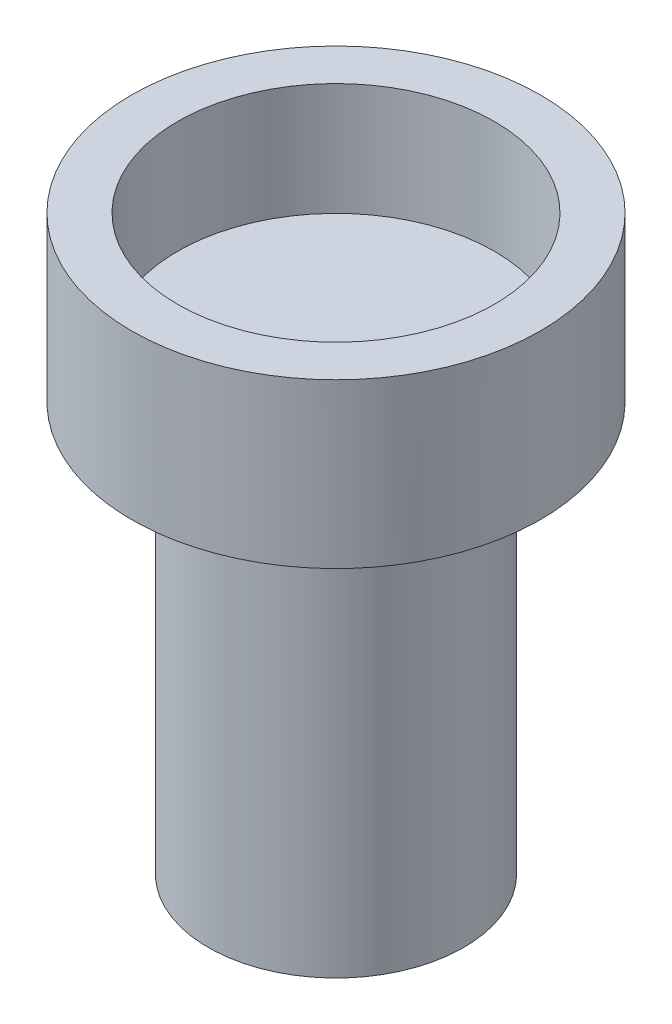
ISO-10303-21;
HEADER;
FILE_DESCRIPTION(('STEP AP214'),'2;1');
FILE_NAME('part.step','',(''),(''),'','','');
FILE_SCHEMA(('AUTOMOTIVE_DESIGN { 1 0 10303 214 1 1 1 1 }'));
ENDSEC;
DATA;
#1=APPLICATION_CONTEXT('core data for automotive mechanical design processes');
#2=APPLICATION_PROTOCOL_DEFINITION('international standard','automotive_design',2000,#1);
#3=PRODUCT_CONTEXT('',#1,'mechanical');
#4=PRODUCT('Part','Part','',(#3));
#5=PRODUCT_RELATED_PRODUCT_CATEGORY('part','',(#4));
#6=PRODUCT_DEFINITION_FORMATION('','',#4);
#7=PRODUCT_DEFINITION_CONTEXT('part definition',#1,'design');
#8=PRODUCT_DEFINITION('design','',#6,#7);
#9=PRODUCT_DEFINITION_SHAPE('','',#8);
#10=(LENGTH_UNIT() NAMED_UNIT(*) SI_UNIT(.MILLI.,.METRE.));
#11=(NAMED_UNIT(*) PLANE_ANGLE_UNIT() SI_UNIT($,.RADIAN.));
#12=(NAMED_UNIT(*) SI_UNIT($,.STERADIAN.) SOLID_ANGLE_UNIT());
#13=UNCERTAINTY_MEASURE_WITH_UNIT(LENGTH_MEASURE(1.E-05),#10,'distance_accuracy_value','');
#14=(GEOMETRIC_REPRESENTATION_CONTEXT(3) GLOBAL_UNCERTAINTY_ASSIGNED_CONTEXT((#13)) GLOBAL_UNIT_ASSIGNED_CONTEXT((#10,
#11,#12)) REPRESENTATION_CONTEXT('',''));
#15=CARTESIAN_POINT('',(0.,0.,0.));
#16=DIRECTION('',(0.,0.,1.));
#17=DIRECTION('',(1.,0.,0.));
#18=AXIS2_PLACEMENT_3D('',#15,#16,#17);
#19=CARTESIAN_POINT('',(0.,2.2,0.));
#20=DIRECTION('',(0.,1.,0.));
#21=DIRECTION('',(0.,0.,1.));
#22=AXIS2_PLACEMENT_3D('',#19,#20,#21);
#23=PLANE('',#22);
#24=CARTESIAN_POINT('',(0.,2.2,0.));
#25=DIRECTION('',(0.,1.,0.));
#26=DIRECTION('',(0.,0.,1.));
#27=AXIS2_PLACEMENT_3D('',#24,#25,#26);
#28=CIRCLE('',#27,4.);
#29=CARTESIAN_POINT('',(0.,2.2,4.));
#30=VERTEX_POINT('',#29);
#31=EDGE_CURVE('E43',#30,#30,#28,.T.);
#32=ORIENTED_EDGE('',*,*,#31,.T.);
#33=EDGE_LOOP('',(#32));
#34=FACE_BOUND('',#33,.T.);
#35=CARTESIAN_POINT('',(0.,2.2,0.));
#36=DIRECTION('',(0.,1.,0.));
#37=DIRECTION('',(0.,0.,1.));
#38=AXIS2_PLACEMENT_3D('',#35,#36,#37);
#39=CIRCLE('',#38,3.1);
#40=CARTESIAN_POINT('',(0.,2.2,3.1));
#41=VERTEX_POINT('',#40);
#42=EDGE_CURVE('E53',#41,#41,#39,.T.);
#43=ORIENTED_EDGE('',*,*,#42,.F.);
#44=EDGE_LOOP('',(#43));
#45=FACE_BOUND('',#44,.T.);
#46=ADVANCED_FACE('F39',(#34,#45),#23,.T.);
#47=CARTESIAN_POINT('',(0.,2.2,0.));
#48=DIRECTION('',(0.,-1.,0.));
#49=DIRECTION('',(0.,0.,-1.));
#50=AXIS2_PLACEMENT_3D('',#47,#48,#49);
#51=CYLINDRICAL_SURFACE('',#50,4.);
#52=ORIENTED_EDGE('',*,*,#31,.F.);
#53=EDGE_LOOP('',(#52));
#54=FACE_BOUND('',#53,.T.);
#55=CARTESIAN_POINT('',(0.,-1.,0.));
#56=DIRECTION('',(0.,-1.,0.));
#57=DIRECTION('',(0.,0.,-1.));
#58=AXIS2_PLACEMENT_3D('',#55,#56,#57);
#59=CIRCLE('',#58,4.);
#60=CARTESIAN_POINT('',(0.,-1.,-4.));
#61=VERTEX_POINT('',#60);
#62=EDGE_CURVE('E57',#61,#61,#59,.T.);
#63=ORIENTED_EDGE('',*,*,#62,.F.);
#64=EDGE_LOOP('',(#63));
#65=FACE_BOUND('',#64,.T.);
#66=ADVANCED_FACE('F41',(#54,#65),#51,.T.);
#67=CARTESIAN_POINT('',(0.,2.2,0.));
#68=DIRECTION('',(0.,-1.,0.));
#69=DIRECTION('',(0.,0.,-1.));
#70=AXIS2_PLACEMENT_3D('',#67,#68,#69);
#71=CYLINDRICAL_SURFACE('',#70,3.1);
#72=ORIENTED_EDGE('',*,*,#42,.T.);
#73=EDGE_LOOP('',(#72));
#74=FACE_BOUND('',#73,.T.);
#75=CARTESIAN_POINT('',(0.,0.,0.));
#76=DIRECTION('',(0.,1.,0.));
#77=DIRECTION('',(0.,0.,1.));
#78=AXIS2_PLACEMENT_3D('',#75,#76,#77);
#79=CIRCLE('',#78,3.1);
#80=CARTESIAN_POINT('',(0.,0.,3.1));
#81=VERTEX_POINT('',#80);
#82=EDGE_CURVE('E61',#81,#81,#79,.T.);
#83=ORIENTED_EDGE('',*,*,#82,.F.);
#84=EDGE_LOOP('',(#83));
#85=FACE_BOUND('',#84,.T.);
#86=ADVANCED_FACE('F70',(#74,#85),#71,.F.);
#87=CARTESIAN_POINT('',(0.,0.,0.));
#88=DIRECTION('',(0.,-1.,0.));
#89=DIRECTION('',(0.,0.,-1.));
#90=AXIS2_PLACEMENT_3D('',#87,#88,#89);
#91=PLANE('',#90);
#92=ORIENTED_EDGE('',*,*,#82,.T.);
#93=EDGE_LOOP('',(#92));
#94=FACE_BOUND('',#93,.T.);
#95=ADVANCED_FACE('F68',(#94),#91,.F.);
#96=CARTESIAN_POINT('',(0.,-1.,0.));
#97=DIRECTION('',(0.,-1.,0.));
#98=DIRECTION('',(0.,0.,-1.));
#99=AXIS2_PLACEMENT_3D('',#96,#97,#98);
#100=PLANE('',#99);
#101=CARTESIAN_POINT('',(0.,-1.,0.));
#102=DIRECTION('',(0.,-1.,0.));
#103=DIRECTION('',(0.,0.,-1.));
#104=AXIS2_PLACEMENT_3D('',#101,#102,#103);
#105=CIRCLE('',#104,2.5);
#106=CARTESIAN_POINT('',(0.,-1.,-2.5));
#107=VERTEX_POINT('',#106);
#108=EDGE_CURVE('E10',#107,#107,#105,.T.);
#109=ORIENTED_EDGE('',*,*,#108,.F.);
#110=EDGE_LOOP('',(#109));
#111=FACE_BOUND('',#110,.T.);
#112=ORIENTED_EDGE('',*,*,#62,.T.);
#113=EDGE_LOOP('',(#112));
#114=FACE_BOUND('',#113,.T.);
#115=ADVANCED_FACE('F78',(#111,#114),#100,.T.);
#116=CARTESIAN_POINT('',(0.,-9.,0.));
#117=DIRECTION('',(0.,1.,0.));
#118=DIRECTION('',(0.,0.,1.));
#119=AXIS2_PLACEMENT_3D('',#116,#117,#118);
#120=CYLINDRICAL_SURFACE('',#119,2.5);
#121=CARTESIAN_POINT('',(0.,-9.,0.));
#122=DIRECTION('',(0.,-1.,0.));
#123=DIRECTION('',(0.,0.,-1.));
#124=AXIS2_PLACEMENT_3D('',#121,#122,#123);
#125=CIRCLE('',#124,2.5);
#126=CARTESIAN_POINT('',(0.,-9.,-2.5));
#127=VERTEX_POINT('',#126);
#128=EDGE_CURVE('E56',#127,#127,#125,.T.);
#129=ORIENTED_EDGE('',*,*,#128,.F.);
#130=EDGE_LOOP('',(#129));
#131=FACE_BOUND('',#130,.T.);
#132=ORIENTED_EDGE('',*,*,#108,.T.);
#133=EDGE_LOOP('',(#132));
#134=FACE_BOUND('',#133,.T.);
#135=ADVANCED_FACE('F92',(#131,#134),#120,.T.);
#136=CARTESIAN_POINT('',(0.,-9.,0.));
#137=DIRECTION('',(0.,-1.,0.));
#138=DIRECTION('',(0.,0.,-1.));
#139=AXIS2_PLACEMENT_3D('',#136,#137,#138);
#140=PLANE('',#139);
#141=ORIENTED_EDGE('',*,*,#128,.T.);
#142=EDGE_LOOP('',(#141));
#143=FACE_BOUND('',#142,.T.);
#144=ADVANCED_FACE('F98',(#143),#140,.T.);
#145=CLOSED_SHELL('',(#46,#66,#86,#95,#115,#135,#144));
#146=MANIFOLD_SOLID_BREP('B2',#145);
#147=ADVANCED_BREP_SHAPE_REPRESENTATION('',(#18,#146),#14);
#148=SHAPE_DEFINITION_REPRESENTATION(#9,#147);
ENDSEC;
END-ISO-10303-21;
